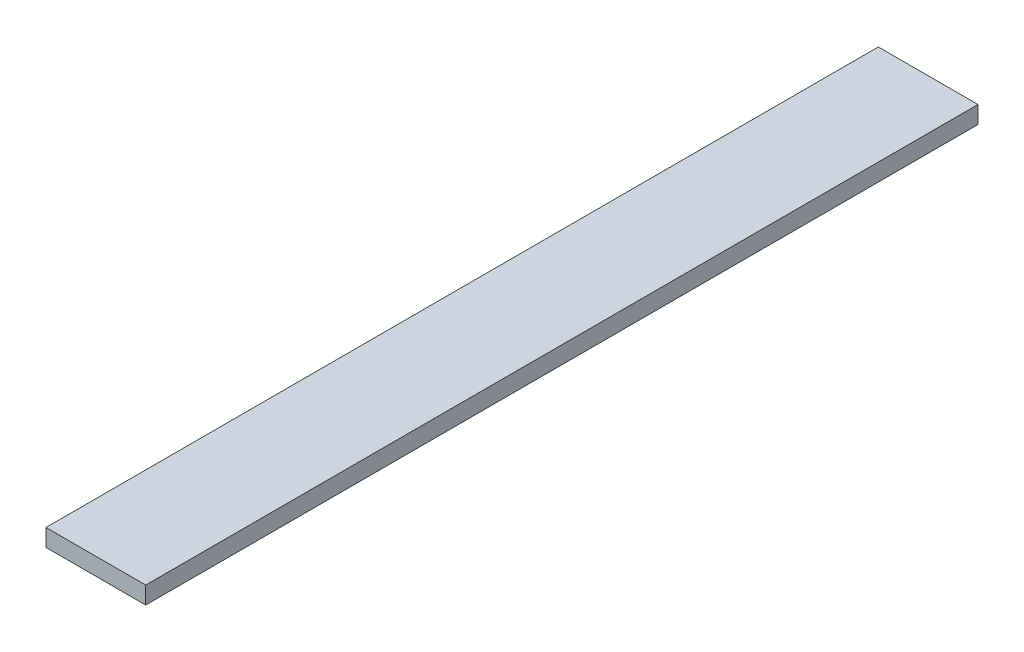
ISO-10303-21;
HEADER;
FILE_DESCRIPTION(('STEP AP214'),'2;1');
FILE_NAME('part.step','',(''),(''),'','','');
FILE_SCHEMA(('AUTOMOTIVE_DESIGN { 1 0 10303 214 1 1 1 1 }'));
ENDSEC;
DATA;
#1=APPLICATION_CONTEXT('core data for automotive mechanical design processes');
#2=APPLICATION_PROTOCOL_DEFINITION('international standard','automotive_design',2000,#1);
#3=PRODUCT_CONTEXT('',#1,'mechanical');
#4=PRODUCT('Part','Part','',(#3));
#5=PRODUCT_RELATED_PRODUCT_CATEGORY('part','',(#4));
#6=PRODUCT_DEFINITION_FORMATION('','',#4);
#7=PRODUCT_DEFINITION_CONTEXT('part definition',#1,'design');
#8=PRODUCT_DEFINITION('design','',#6,#7);
#9=PRODUCT_DEFINITION_SHAPE('','',#8);
#10=(LENGTH_UNIT() NAMED_UNIT(*) SI_UNIT(.MILLI.,.METRE.));
#11=(NAMED_UNIT(*) PLANE_ANGLE_UNIT() SI_UNIT($,.RADIAN.));
#12=(NAMED_UNIT(*) SI_UNIT($,.STERADIAN.) SOLID_ANGLE_UNIT());
#13=UNCERTAINTY_MEASURE_WITH_UNIT(LENGTH_MEASURE(1.E-05),#10,'distance_accuracy_value','');
#14=(GEOMETRIC_REPRESENTATION_CONTEXT(3) GLOBAL_UNCERTAINTY_ASSIGNED_CONTEXT((#13)) GLOBAL_UNIT_ASSIGNED_CONTEXT((#10,
#11,#12)) REPRESENTATION_CONTEXT('',''));
#15=CARTESIAN_POINT('',(0.,0.,0.));
#16=DIRECTION('',(0.,0.,1.));
#17=DIRECTION('',(1.,0.,0.));
#18=AXIS2_PLACEMENT_3D('',#15,#16,#17);
#19=CARTESIAN_POINT('',(-57.5,10.,960.));
#20=DIRECTION('',(1.,0.,0.));
#21=DIRECTION('',(0.,0.,-1.));
#22=AXIS2_PLACEMENT_3D('',#19,#20,#21);
#23=PLANE('',#22);
#24=DIRECTION('',(0.,-1.,0.));
#25=VECTOR('',#24,1.);
#26=CARTESIAN_POINT('',(-57.5,10.,0.));
#27=LINE('',#26,#25);
#28=CARTESIAN_POINT('',(-57.5,10.,0.));
#29=VERTEX_POINT('',#28);
#30=CARTESIAN_POINT('',(-57.5,-10.,0.));
#31=VERTEX_POINT('',#30);
#32=EDGE_CURVE('E96',#29,#31,#27,.T.);
#33=ORIENTED_EDGE('',*,*,#32,.T.);
#34=DIRECTION('',(0.,0.,-1.));
#35=VECTOR('',#34,1.);
#36=CARTESIAN_POINT('',(-57.5,-10.,960.));
#37=LINE('',#36,#35);
#38=CARTESIAN_POINT('',(-57.5,-10.,960.));
#39=VERTEX_POINT('',#38);
#40=EDGE_CURVE('E11',#39,#31,#37,.T.);
#41=ORIENTED_EDGE('',*,*,#40,.F.);
#42=DIRECTION('',(0.,-1.,0.));
#43=VECTOR('',#42,1.);
#44=CARTESIAN_POINT('',(-57.5,10.,960.));
#45=LINE('',#44,#43);
#46=CARTESIAN_POINT('',(-57.5,10.,960.));
#47=VERTEX_POINT('',#46);
#48=EDGE_CURVE('E82',#47,#39,#45,.T.);
#49=ORIENTED_EDGE('',*,*,#48,.F.);
#50=DIRECTION('',(0.,0.,-1.));
#51=VECTOR('',#50,1.);
#52=CARTESIAN_POINT('',(-57.5,10.,960.));
#53=LINE('',#52,#51);
#54=EDGE_CURVE('E49',#47,#29,#53,.T.);
#55=ORIENTED_EDGE('',*,*,#54,.T.);
#56=EDGE_LOOP('',(#33,#41,#49,#55));
#57=FACE_BOUND('',#56,.T.);
#58=ADVANCED_FACE('F33',(#57),#23,.F.);
#59=CARTESIAN_POINT('',(-57.5,-10.,960.));
#60=DIRECTION('',(0.,1.,0.));
#61=DIRECTION('',(0.,0.,1.));
#62=AXIS2_PLACEMENT_3D('',#59,#60,#61);
#63=PLANE('',#62);
#64=DIRECTION('',(1.,0.,0.));
#65=VECTOR('',#64,1.);
#66=CARTESIAN_POINT('',(-57.5,-10.,0.));
#67=LINE('',#66,#65);
#68=CARTESIAN_POINT('',(57.5,-10.,0.));
#69=VERTEX_POINT('',#68);
#70=EDGE_CURVE('E87',#31,#69,#67,.T.);
#71=ORIENTED_EDGE('',*,*,#70,.T.);
#72=DIRECTION('',(0.,0.,-1.));
#73=VECTOR('',#72,1.);
#74=CARTESIAN_POINT('',(57.5,-10.,960.));
#75=LINE('',#74,#73);
#76=CARTESIAN_POINT('',(57.5,-10.,960.));
#77=VERTEX_POINT('',#76);
#78=EDGE_CURVE('E41',#77,#69,#75,.T.);
#79=ORIENTED_EDGE('',*,*,#78,.F.);
#80=DIRECTION('',(1.,0.,0.));
#81=VECTOR('',#80,1.);
#82=CARTESIAN_POINT('',(-57.5,-10.,960.));
#83=LINE('',#82,#81);
#84=EDGE_CURVE('E74',#39,#77,#83,.T.);
#85=ORIENTED_EDGE('',*,*,#84,.F.);
#86=ORIENTED_EDGE('',*,*,#40,.T.);
#87=EDGE_LOOP('',(#71,#79,#85,#86));
#88=FACE_BOUND('',#87,.T.);
#89=ADVANCED_FACE('F86',(#88),#63,.F.);
#90=CARTESIAN_POINT('',(57.5,10.,960.));
#91=DIRECTION('',(1.,0.,0.));
#92=DIRECTION('',(0.,0.,-1.));
#93=AXIS2_PLACEMENT_3D('',#90,#91,#92);
#94=PLANE('',#93);
#95=DIRECTION('',(0.,-1.,0.));
#96=VECTOR('',#95,1.);
#97=CARTESIAN_POINT('',(57.5,10.,0.));
#98=LINE('',#97,#96);
#99=CARTESIAN_POINT('',(57.5,10.,0.));
#100=VERTEX_POINT('',#99);
#101=EDGE_CURVE('E99',#100,#69,#98,.T.);
#102=ORIENTED_EDGE('',*,*,#101,.F.);
#103=DIRECTION('',(0.,0.,-1.));
#104=VECTOR('',#103,1.);
#105=CARTESIAN_POINT('',(57.5,10.,960.));
#106=LINE('',#105,#104);
#107=CARTESIAN_POINT('',(57.5,10.,960.));
#108=VERTEX_POINT('',#107);
#109=EDGE_CURVE('E63',#108,#100,#106,.T.);
#110=ORIENTED_EDGE('',*,*,#109,.F.);
#111=DIRECTION('',(0.,-1.,0.));
#112=VECTOR('',#111,1.);
#113=CARTESIAN_POINT('',(57.5,10.,960.));
#114=LINE('',#113,#112);
#115=EDGE_CURVE('E81',#108,#77,#114,.T.);
#116=ORIENTED_EDGE('',*,*,#115,.T.);
#117=ORIENTED_EDGE('',*,*,#78,.T.);
#118=EDGE_LOOP('',(#102,#110,#116,#117));
#119=FACE_BOUND('',#118,.T.);
#120=ADVANCED_FACE('F90',(#119),#94,.T.);
#121=CARTESIAN_POINT('',(-57.5,10.,960.));
#122=DIRECTION('',(0.,1.,0.));
#123=DIRECTION('',(0.,0.,1.));
#124=AXIS2_PLACEMENT_3D('',#121,#122,#123);
#125=PLANE('',#124);
#126=DIRECTION('',(1.,0.,0.));
#127=VECTOR('',#126,1.);
#128=CARTESIAN_POINT('',(-57.5,10.,0.));
#129=LINE('',#128,#127);
#130=EDGE_CURVE('E101',#29,#100,#129,.T.);
#131=ORIENTED_EDGE('',*,*,#130,.F.);
#132=ORIENTED_EDGE('',*,*,#54,.F.);
#133=DIRECTION('',(1.,0.,0.));
#134=VECTOR('',#133,1.);
#135=CARTESIAN_POINT('',(-57.5,10.,960.));
#136=LINE('',#135,#134);
#137=EDGE_CURVE('E91',#47,#108,#136,.T.);
#138=ORIENTED_EDGE('',*,*,#137,.T.);
#139=ORIENTED_EDGE('',*,*,#109,.T.);
#140=EDGE_LOOP('',(#131,#132,#138,#139));
#141=FACE_BOUND('',#140,.T.);
#142=ADVANCED_FACE('F107',(#141),#125,.T.);
#143=CARTESIAN_POINT('',(0.,0.,960.));
#144=DIRECTION('',(0.,0.,1.));
#145=DIRECTION('',(1.,0.,0.));
#146=AXIS2_PLACEMENT_3D('',#143,#144,#145);
#147=PLANE('',#146);
#148=ORIENTED_EDGE('',*,*,#48,.T.);
#149=ORIENTED_EDGE('',*,*,#84,.T.);
#150=ORIENTED_EDGE('',*,*,#115,.F.);
#151=ORIENTED_EDGE('',*,*,#137,.F.);
#152=EDGE_LOOP('',(#148,#149,#150,#151));
#153=FACE_BOUND('',#152,.T.);
#154=ADVANCED_FACE('F78',(#153),#147,.T.);
#155=CARTESIAN_POINT('',(0.,0.,0.));
#156=DIRECTION('',(0.,0.,1.));
#157=DIRECTION('',(1.,0.,0.));
#158=AXIS2_PLACEMENT_3D('',#155,#156,#157);
#159=PLANE('',#158);
#160=ORIENTED_EDGE('',*,*,#32,.F.);
#161=ORIENTED_EDGE('',*,*,#130,.T.);
#162=ORIENTED_EDGE('',*,*,#101,.T.);
#163=ORIENTED_EDGE('',*,*,#70,.F.);
#164=EDGE_LOOP('',(#160,#161,#162,#163));
#165=FACE_BOUND('',#164,.T.);
#166=ADVANCED_FACE('F106',(#165),#159,.F.);
#167=CLOSED_SHELL('',(#58,#89,#120,#142,#154,#166));
#168=MANIFOLD_SOLID_BREP('B2',#167);
#169=ADVANCED_BREP_SHAPE_REPRESENTATION('',(#18,#168),#14);
#170=SHAPE_DEFINITION_REPRESENTATION(#9,#169);
ENDSEC;
END-ISO-10303-21;
